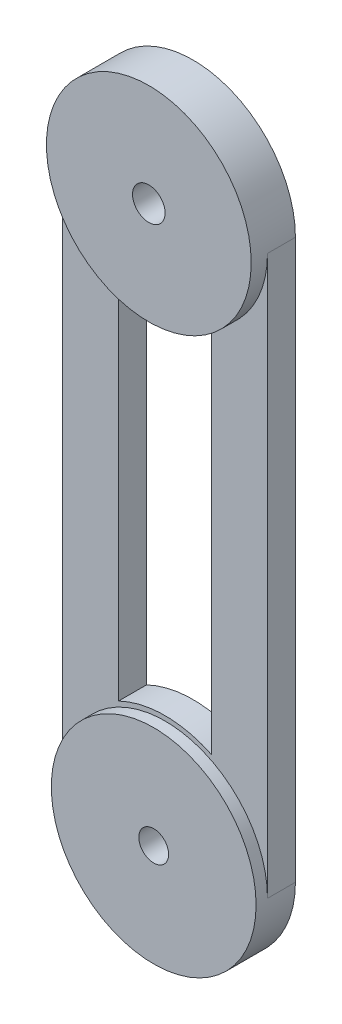
ISO-10303-21;
HEADER;
FILE_DESCRIPTION(('STEP AP214'),'2;1');
FILE_NAME('part.step','',(''),(''),'','','');
FILE_SCHEMA(('AUTOMOTIVE_DESIGN { 1 0 10303 214 1 1 1 1 }'));
ENDSEC;
DATA;
#1=APPLICATION_CONTEXT('core data for automotive mechanical design processes');
#2=APPLICATION_PROTOCOL_DEFINITION('international standard','automotive_design',2000,#1);
#3=PRODUCT_CONTEXT('',#1,'mechanical');
#4=PRODUCT('Part','Part','',(#3));
#5=PRODUCT_RELATED_PRODUCT_CATEGORY('part','',(#4));
#6=PRODUCT_DEFINITION_FORMATION('','',#4);
#7=PRODUCT_DEFINITION_CONTEXT('part definition',#1,'design');
#8=PRODUCT_DEFINITION('design','',#6,#7);
#9=PRODUCT_DEFINITION_SHAPE('','',#8);
#10=(LENGTH_UNIT() NAMED_UNIT(*) SI_UNIT(.MILLI.,.METRE.));
#11=(NAMED_UNIT(*) PLANE_ANGLE_UNIT() SI_UNIT($,.RADIAN.));
#12=(NAMED_UNIT(*) SI_UNIT($,.STERADIAN.) SOLID_ANGLE_UNIT());
#13=UNCERTAINTY_MEASURE_WITH_UNIT(LENGTH_MEASURE(1.E-05),#10,'distance_accuracy_value','');
#14=(GEOMETRIC_REPRESENTATION_CONTEXT(3) GLOBAL_UNCERTAINTY_ASSIGNED_CONTEXT((#13)) GLOBAL_UNIT_ASSIGNED_CONTEXT((#10,
#11,#12)) REPRESENTATION_CONTEXT('',''));
#15=CARTESIAN_POINT('',(0.,0.,0.));
#16=DIRECTION('',(0.,0.,1.));
#17=DIRECTION('',(1.,0.,0.));
#18=AXIS2_PLACEMENT_3D('',#15,#16,#17);
#19=CARTESIAN_POINT('',(0.,-30.,5.7504833995939));
#20=DIRECTION('',(0.,0.,-1.));
#21=DIRECTION('',(1.,0.,0.));
#22=AXIS2_PLACEMENT_3D('',#19,#20,#21);
#23=CYLINDRICAL_SURFACE('',#22,1.6);
#24=CARTESIAN_POINT('',(0.,-30.,1.225));
#25=DIRECTION('',(0.,0.,1.));
#26=DIRECTION('',(1.,0.,0.));
#27=AXIS2_PLACEMENT_3D('',#24,#25,#26);
#28=CIRCLE('',#27,1.6);
#29=CARTESIAN_POINT('',(1.59999999999999,-30.,1.225));
#30=VERTEX_POINT('',#29);
#31=EDGE_CURVE('E382',#30,#30,#28,.F.);
#32=ORIENTED_EDGE('',*,*,#31,.F.);
#33=EDGE_LOOP('',(#32));
#34=FACE_BOUND('',#33,.T.);
#35=CARTESIAN_POINT('',(0.,-30.,-1.775));
#36=DIRECTION('',(0.,0.,1.));
#37=DIRECTION('',(1.,0.,0.));
#38=AXIS2_PLACEMENT_3D('',#35,#36,#37);
#39=CIRCLE('',#38,1.6);
#40=CARTESIAN_POINT('',(1.59999999999999,-30.,-1.775));
#41=VERTEX_POINT('',#40);
#42=EDGE_CURVE('E381',#41,#41,#39,.F.);
#43=ORIENTED_EDGE('',*,*,#42,.T.);
#44=EDGE_LOOP('',(#43));
#45=FACE_BOUND('',#44,.T.);
#46=ADVANCED_FACE('F37',(#34,#45),#23,.F.);
#47=CARTESIAN_POINT('',(0.,30.,6.69974746830584));
#48=DIRECTION('',(0.,0.,-1.));
#49=DIRECTION('',(1.,0.,0.));
#50=AXIS2_PLACEMENT_3D('',#47,#48,#49);
#51=CYLINDRICAL_SURFACE('',#50,1.75);
#52=CARTESIAN_POINT('',(0.,30.,1.75));
#53=DIRECTION('',(0.,0.,1.));
#54=DIRECTION('',(1.,0.,0.));
#55=AXIS2_PLACEMENT_3D('',#52,#53,#54);
#56=CIRCLE('',#55,1.75);
#57=CARTESIAN_POINT('',(1.74999999999999,30.,1.75));
#58=VERTEX_POINT('',#57);
#59=EDGE_CURVE('E404',#58,#58,#56,.F.);
#60=ORIENTED_EDGE('',*,*,#59,.F.);
#61=EDGE_LOOP('',(#60));
#62=FACE_BOUND('',#61,.T.);
#63=CARTESIAN_POINT('',(0.,30.,-1.25));
#64=DIRECTION('',(0.,0.,1.));
#65=DIRECTION('',(1.,0.,0.));
#66=AXIS2_PLACEMENT_3D('',#63,#64,#65);
#67=CIRCLE('',#66,1.75);
#68=CARTESIAN_POINT('',(1.74999999999999,30.,-1.25));
#69=VERTEX_POINT('',#68);
#70=EDGE_CURVE('E394',#69,#69,#67,.F.);
#71=ORIENTED_EDGE('',*,*,#70,.T.);
#72=EDGE_LOOP('',(#71));
#73=FACE_BOUND('',#72,.T.);
#74=ADVANCED_FACE('F189',(#62,#73),#51,.F.);
#75=CARTESIAN_POINT('',(-11.,0.,-3.));
#76=DIRECTION('',(1.,0.,0.));
#77=DIRECTION('',(0.,0.,1.));
#78=AXIS2_PLACEMENT_3D('',#75,#76,#77);
#79=PLANE('',#78);
#80=DIRECTION('',(0.,-1.,0.));
#81=VECTOR('',#80,1.);
#82=CARTESIAN_POINT('',(-11.,0.,0.));
#83=LINE('',#82,#81);
#84=CARTESIAN_POINT('',(-11.,30.,0.));
#85=VERTEX_POINT('',#84);
#86=CARTESIAN_POINT('',(-11.,-30.,0.));
#87=VERTEX_POINT('',#86);
#88=EDGE_CURVE('E145',#85,#87,#83,.T.);
#89=ORIENTED_EDGE('',*,*,#88,.F.);
#90=DIRECTION('',(0.,0.,1.));
#91=VECTOR('',#90,1.);
#92=CARTESIAN_POINT('',(-11.,30.,-3.));
#93=LINE('',#92,#91);
#94=CARTESIAN_POINT('',(-11.,30.,-3.));
#95=VERTEX_POINT('',#94);
#96=EDGE_CURVE('E150',#95,#85,#93,.T.);
#97=ORIENTED_EDGE('',*,*,#96,.F.);
#98=DIRECTION('',(0.,-1.,0.));
#99=VECTOR('',#98,1.);
#100=CARTESIAN_POINT('',(-11.,0.,-3.));
#101=LINE('',#100,#99);
#102=CARTESIAN_POINT('',(-11.,-30.,-3.));
#103=VERTEX_POINT('',#102);
#104=EDGE_CURVE('E125',#95,#103,#101,.T.);
#105=ORIENTED_EDGE('',*,*,#104,.T.);
#106=DIRECTION('',(0.,0.,1.));
#107=VECTOR('',#106,1.);
#108=CARTESIAN_POINT('',(-11.,-30.,-3.));
#109=LINE('',#108,#107);
#110=EDGE_CURVE('E47',#103,#87,#109,.T.);
#111=ORIENTED_EDGE('',*,*,#110,.T.);
#112=EDGE_LOOP('',(#89,#97,#105,#111));
#113=FACE_BOUND('',#112,.T.);
#114=ADVANCED_FACE('F195',(#113),#79,.F.);
#115=CARTESIAN_POINT('',(0.,-30.,-3.));
#116=DIRECTION('',(0.,0.,1.));
#117=DIRECTION('',(-1.,0.,0.));
#118=AXIS2_PLACEMENT_3D('',#115,#116,#117);
#119=CYLINDRICAL_SURFACE('',#118,11.);
#120=ORIENTED_EDGE('',*,*,#110,.F.);
#121=CARTESIAN_POINT('',(0.,-30.,-3.));
#122=DIRECTION('',(0.,0.,1.));
#123=DIRECTION('',(1.,0.,0.));
#124=AXIS2_PLACEMENT_3D('',#121,#122,#123);
#125=CIRCLE('',#124,11.);
#126=CARTESIAN_POINT('',(11.,-30.,-3.));
#127=VERTEX_POINT('',#126);
#128=EDGE_CURVE('E111',#103,#127,#125,.T.);
#129=ORIENTED_EDGE('',*,*,#128,.T.);
#130=DIRECTION('',(0.,0.,1.));
#131=VECTOR('',#130,1.);
#132=CARTESIAN_POINT('',(11.,-30.,-3.));
#133=LINE('',#132,#131);
#134=CARTESIAN_POINT('',(11.,-30.,0.));
#135=VERTEX_POINT('',#134);
#136=EDGE_CURVE('E115',#127,#135,#133,.T.);
#137=ORIENTED_EDGE('',*,*,#136,.T.);
#138=CARTESIAN_POINT('',(0.,-30.,0.));
#139=DIRECTION('',(0.,0.,1.));
#140=DIRECTION('',(1.,0.,0.));
#141=AXIS2_PLACEMENT_3D('',#138,#139,#140);
#142=CIRCLE('',#141,11.);
#143=EDGE_CURVE('E385',#135,#87,#142,.T.);
#144=ORIENTED_EDGE('',*,*,#143,.T.);
#145=EDGE_LOOP('',(#120,#129,#137,#144));
#146=FACE_BOUND('',#145,.T.);
#147=CARTESIAN_POINT('',(0.,-30.,1.225));
#148=DIRECTION('',(0.,0.,1.));
#149=DIRECTION('',(1.,0.,0.));
#150=AXIS2_PLACEMENT_3D('',#147,#148,#149);
#151=CIRCLE('',#150,11.);
#152=CARTESIAN_POINT('',(11.,-30.,1.225));
#153=VERTEX_POINT('',#152);
#154=EDGE_CURVE('E391',#153,#153,#151,.T.);
#155=ORIENTED_EDGE('',*,*,#154,.F.);
#156=EDGE_LOOP('',(#155));
#157=FACE_BOUND('',#156,.T.);
#158=ADVANCED_FACE('F121',(#146,#157),#119,.T.);
#159=CARTESIAN_POINT('',(11.,0.,-3.));
#160=DIRECTION('',(1.,0.,0.));
#161=DIRECTION('',(0.,0.,1.));
#162=AXIS2_PLACEMENT_3D('',#159,#160,#161);
#163=PLANE('',#162);
#164=DIRECTION('',(0.,-1.,0.));
#165=VECTOR('',#164,1.);
#166=CARTESIAN_POINT('',(11.,0.,0.));
#167=LINE('',#166,#165);
#168=CARTESIAN_POINT('',(11.,30.,0.));
#169=VERTEX_POINT('',#168);
#170=EDGE_CURVE('E80',#169,#135,#167,.T.);
#171=ORIENTED_EDGE('',*,*,#170,.T.);
#172=ORIENTED_EDGE('',*,*,#136,.F.);
#173=DIRECTION('',(0.,-1.,0.));
#174=VECTOR('',#173,1.);
#175=CARTESIAN_POINT('',(11.,0.,-3.));
#176=LINE('',#175,#174);
#177=CARTESIAN_POINT('',(11.,30.,-3.));
#178=VERTEX_POINT('',#177);
#179=EDGE_CURVE('E108',#178,#127,#176,.T.);
#180=ORIENTED_EDGE('',*,*,#179,.F.);
#181=DIRECTION('',(0.,0.,1.));
#182=VECTOR('',#181,1.);
#183=CARTESIAN_POINT('',(11.,30.,-3.));
#184=LINE('',#183,#182);
#185=EDGE_CURVE('E119',#178,#169,#184,.T.);
#186=ORIENTED_EDGE('',*,*,#185,.T.);
#187=EDGE_LOOP('',(#171,#172,#180,#186));
#188=FACE_BOUND('',#187,.T.);
#189=ADVANCED_FACE('F116',(#188),#163,.T.);
#190=CARTESIAN_POINT('',(0.,30.,-3.));
#191=DIRECTION('',(0.,0.,1.));
#192=DIRECTION('',(-1.,0.,0.));
#193=AXIS2_PLACEMENT_3D('',#190,#191,#192);
#194=CYLINDRICAL_SURFACE('',#193,11.5);
#195=CARTESIAN_POINT('',(0.,30.,0.));
#196=DIRECTION('',(0.,0.,1.));
#197=DIRECTION('',(1.,0.,0.));
#198=AXIS2_PLACEMENT_3D('',#195,#196,#197);
#199=CIRCLE('',#198,11.5);
#200=CARTESIAN_POINT('',(-5.00000000000001,19.643842411396,0.));
#201=VERTEX_POINT('',#200);
#202=CARTESIAN_POINT('',(5.00000000000001,19.643842411396,0.));
#203=VERTEX_POINT('',#202);
#204=EDGE_CURVE('E133',#201,#203,#199,.T.);
#205=ORIENTED_EDGE('',*,*,#204,.F.);
#206=DIRECTION('',(0.,0.,1.));
#207=VECTOR('',#206,1.);
#208=CARTESIAN_POINT('',(-5.00000000000001,19.643842411396,-3.));
#209=LINE('',#208,#207);
#210=CARTESIAN_POINT('',(-5.00000000000001,19.643842411396,-3.));
#211=VERTEX_POINT('',#210);
#212=EDGE_CURVE('E132',#211,#201,#209,.T.);
#213=ORIENTED_EDGE('',*,*,#212,.F.);
#214=CARTESIAN_POINT('',(0.,30.,-3.));
#215=DIRECTION('',(0.,0.,1.));
#216=DIRECTION('',(1.,0.,0.));
#217=AXIS2_PLACEMENT_3D('',#214,#215,#216);
#218=CIRCLE('',#217,11.5);
#219=CARTESIAN_POINT('',(5.00000000000001,19.643842411396,-3.));
#220=VERTEX_POINT('',#219);
#221=EDGE_CURVE('E149',#211,#220,#218,.T.);
#222=ORIENTED_EDGE('',*,*,#221,.T.);
#223=DIRECTION('',(0.,0.,1.));
#224=VECTOR('',#223,1.);
#225=CARTESIAN_POINT('',(5.00000000000001,19.643842411396,-3.));
#226=LINE('',#225,#224);
#227=EDGE_CURVE('E41',#220,#203,#226,.T.);
#228=ORIENTED_EDGE('',*,*,#227,.T.);
#229=EDGE_LOOP('',(#205,#213,#222,#228));
#230=FACE_BOUND('',#229,.T.);
#231=ADVANCED_FACE('F39',(#230),#194,.T.);
#232=CARTESIAN_POINT('',(5.00000000000001,0.,-3.));
#233=DIRECTION('',(1.,0.,0.));
#234=DIRECTION('',(0.,0.,1.));
#235=AXIS2_PLACEMENT_3D('',#232,#233,#234);
#236=PLANE('',#235);
#237=DIRECTION('',(0.,-1.,0.));
#238=VECTOR('',#237,1.);
#239=CARTESIAN_POINT('',(5.00000000000001,0.,0.));
#240=LINE('',#239,#238);
#241=CARTESIAN_POINT('',(5.00000000000001,-19.643842411396,0.));
#242=VERTEX_POINT('',#241);
#243=EDGE_CURVE('E136',#203,#242,#240,.T.);
#244=ORIENTED_EDGE('',*,*,#243,.F.);
#245=ORIENTED_EDGE('',*,*,#227,.F.);
#246=DIRECTION('',(0.,-1.,0.));
#247=VECTOR('',#246,1.);
#248=CARTESIAN_POINT('',(5.00000000000001,0.,-3.));
#249=LINE('',#248,#247);
#250=CARTESIAN_POINT('',(5.00000000000001,-19.643842411396,-3.));
#251=VERTEX_POINT('',#250);
#252=EDGE_CURVE('E91',#220,#251,#249,.T.);
#253=ORIENTED_EDGE('',*,*,#252,.T.);
#254=DIRECTION('',(0.,0.,1.));
#255=VECTOR('',#254,1.);
#256=CARTESIAN_POINT('',(5.00000000000001,-19.643842411396,-3.));
#257=LINE('',#256,#255);
#258=EDGE_CURVE('E158',#251,#242,#257,.T.);
#259=ORIENTED_EDGE('',*,*,#258,.T.);
#260=EDGE_LOOP('',(#244,#245,#253,#259));
#261=FACE_BOUND('',#260,.T.);
#262=ADVANCED_FACE('F181',(#261),#236,.F.);
#263=CARTESIAN_POINT('',(0.,-30.,-3.));
#264=DIRECTION('',(0.,0.,1.));
#265=DIRECTION('',(-1.,0.,0.));
#266=AXIS2_PLACEMENT_3D('',#263,#264,#265);
#267=CYLINDRICAL_SURFACE('',#266,11.5);
#268=CARTESIAN_POINT('',(0.,-30.,0.));
#269=DIRECTION('',(0.,0.,1.));
#270=DIRECTION('',(1.,0.,0.));
#271=AXIS2_PLACEMENT_3D('',#268,#269,#270);
#272=CIRCLE('',#271,11.5);
#273=CARTESIAN_POINT('',(-5.,-19.643842411396,0.));
#274=VERTEX_POINT('',#273);
#275=EDGE_CURVE('E140',#242,#274,#272,.T.);
#276=ORIENTED_EDGE('',*,*,#275,.F.);
#277=ORIENTED_EDGE('',*,*,#258,.F.);
#278=CARTESIAN_POINT('',(0.,-30.,-3.));
#279=DIRECTION('',(0.,0.,1.));
#280=DIRECTION('',(1.,0.,0.));
#281=AXIS2_PLACEMENT_3D('',#278,#279,#280);
#282=CIRCLE('',#281,11.5);
#283=CARTESIAN_POINT('',(-5.,-19.643842411396,-3.));
#284=VERTEX_POINT('',#283);
#285=EDGE_CURVE('E174',#251,#284,#282,.T.);
#286=ORIENTED_EDGE('',*,*,#285,.T.);
#287=DIRECTION('',(0.,0.,1.));
#288=VECTOR('',#287,1.);
#289=CARTESIAN_POINT('',(-5.,-19.643842411396,-3.));
#290=LINE('',#289,#288);
#291=EDGE_CURVE('E156',#284,#274,#290,.T.);
#292=ORIENTED_EDGE('',*,*,#291,.T.);
#293=EDGE_LOOP('',(#276,#277,#286,#292));
#294=FACE_BOUND('',#293,.T.);
#295=ADVANCED_FACE('F180',(#294),#267,.T.);
#296=CARTESIAN_POINT('',(-5.00000000000001,0.,-3.));
#297=DIRECTION('',(1.,0.,0.));
#298=DIRECTION('',(0.,1.,0.));
#299=AXIS2_PLACEMENT_3D('',#296,#297,#298);
#300=PLANE('',#299);
#301=DIRECTION('',(0.,-1.,0.));
#302=VECTOR('',#301,1.);
#303=CARTESIAN_POINT('',(-5.00000000000001,0.,0.));
#304=LINE('',#303,#302);
#305=EDGE_CURVE('E143',#201,#274,#304,.T.);
#306=ORIENTED_EDGE('',*,*,#305,.T.);
#307=ORIENTED_EDGE('',*,*,#291,.F.);
#308=DIRECTION('',(0.,-1.,0.));
#309=VECTOR('',#308,1.);
#310=CARTESIAN_POINT('',(-5.00000000000001,0.,-3.));
#311=LINE('',#310,#309);
#312=EDGE_CURVE('E127',#211,#284,#311,.T.);
#313=ORIENTED_EDGE('',*,*,#312,.F.);
#314=ORIENTED_EDGE('',*,*,#212,.T.);
#315=EDGE_LOOP('',(#306,#307,#313,#314));
#316=FACE_BOUND('',#315,.T.);
#317=ADVANCED_FACE('F172',(#316),#300,.T.);
#318=CARTESIAN_POINT('',(0.,30.,-3.));
#319=DIRECTION('',(0.,0.,1.));
#320=DIRECTION('',(-1.,0.,0.));
#321=AXIS2_PLACEMENT_3D('',#318,#319,#320);
#322=CYLINDRICAL_SURFACE('',#321,11.);
#323=ORIENTED_EDGE('',*,*,#185,.F.);
#324=CARTESIAN_POINT('',(0.,30.,-3.));
#325=DIRECTION('',(0.,0.,1.));
#326=DIRECTION('',(1.,0.,0.));
#327=AXIS2_PLACEMENT_3D('',#324,#325,#326);
#328=CIRCLE('',#327,11.);
#329=EDGE_CURVE('E56',#178,#95,#328,.T.);
#330=ORIENTED_EDGE('',*,*,#329,.T.);
#331=ORIENTED_EDGE('',*,*,#96,.T.);
#332=CARTESIAN_POINT('',(0.,30.,0.));
#333=DIRECTION('',(0.,0.,1.));
#334=DIRECTION('',(1.,0.,0.));
#335=AXIS2_PLACEMENT_3D('',#332,#333,#334);
#336=CIRCLE('',#335,11.);
#337=EDGE_CURVE('E12',#85,#169,#336,.T.);
#338=ORIENTED_EDGE('',*,*,#337,.T.);
#339=EDGE_LOOP('',(#323,#330,#331,#338));
#340=FACE_BOUND('',#339,.T.);
#341=CARTESIAN_POINT('',(0.,30.,1.75));
#342=DIRECTION('',(0.,0.,1.));
#343=DIRECTION('',(1.,0.,0.));
#344=AXIS2_PLACEMENT_3D('',#341,#342,#343);
#345=CIRCLE('',#344,11.);
#346=CARTESIAN_POINT('',(11.,30.,1.75));
#347=VERTEX_POINT('',#346);
#348=EDGE_CURVE('E137',#347,#347,#345,.T.);
#349=ORIENTED_EDGE('',*,*,#348,.F.);
#350=EDGE_LOOP('',(#349));
#351=FACE_BOUND('',#350,.T.);
#352=ADVANCED_FACE('F222',(#340,#351),#322,.T.);
#353=CARTESIAN_POINT('',(0.,0.,-3.));
#354=DIRECTION('',(0.,0.,-1.));
#355=DIRECTION('',(1.,0.,0.));
#356=AXIS2_PLACEMENT_3D('',#353,#354,#355);
#357=PLANE('',#356);
#358=CARTESIAN_POINT('',(0.,-30.,-3.));
#359=DIRECTION('',(0.,0.,1.));
#360=DIRECTION('',(1.,0.,0.));
#361=AXIS2_PLACEMENT_3D('',#358,#359,#360);
#362=CIRCLE('',#361,3.);
#363=CARTESIAN_POINT('',(2.99999999999999,-30.,-3.));
#364=VERTEX_POINT('',#363);
#365=EDGE_CURVE('E387',#364,#364,#362,.T.);
#366=ORIENTED_EDGE('',*,*,#365,.T.);
#367=EDGE_LOOP('',(#366));
#368=FACE_BOUND('',#367,.T.);
#369=CARTESIAN_POINT('',(0.,30.,-3.));
#370=DIRECTION('',(0.,0.,1.));
#371=DIRECTION('',(1.,0.,0.));
#372=AXIS2_PLACEMENT_3D('',#369,#370,#371);
#373=CIRCLE('',#372,3.);
#374=CARTESIAN_POINT('',(2.99999999999999,30.,-3.));
#375=VERTEX_POINT('',#374);
#376=EDGE_CURVE('E396',#375,#375,#373,.T.);
#377=ORIENTED_EDGE('',*,*,#376,.T.);
#378=EDGE_LOOP('',(#377));
#379=FACE_BOUND('',#378,.T.);
#380=ORIENTED_EDGE('',*,*,#221,.F.);
#381=ORIENTED_EDGE('',*,*,#312,.T.);
#382=ORIENTED_EDGE('',*,*,#285,.F.);
#383=ORIENTED_EDGE('',*,*,#252,.F.);
#384=EDGE_LOOP('',(#380,#381,#382,#383));
#385=FACE_BOUND('',#384,.T.);
#386=ORIENTED_EDGE('',*,*,#104,.F.);
#387=ORIENTED_EDGE('',*,*,#329,.F.);
#388=ORIENTED_EDGE('',*,*,#179,.T.);
#389=ORIENTED_EDGE('',*,*,#128,.F.);
#390=EDGE_LOOP('',(#386,#387,#388,#389));
#391=FACE_BOUND('',#390,.T.);
#392=ADVANCED_FACE('F109',(#368,#379,#385,#391),#357,.T.);
#393=CARTESIAN_POINT('',(0.,0.,0.));
#394=DIRECTION('',(0.,0.,-1.));
#395=DIRECTION('',(1.,0.,0.));
#396=AXIS2_PLACEMENT_3D('',#393,#394,#395);
#397=PLANE('',#396);
#398=ORIENTED_EDGE('',*,*,#204,.T.);
#399=ORIENTED_EDGE('',*,*,#243,.T.);
#400=ORIENTED_EDGE('',*,*,#275,.T.);
#401=ORIENTED_EDGE('',*,*,#305,.F.);
#402=EDGE_LOOP('',(#398,#399,#400,#401));
#403=FACE_BOUND('',#402,.T.);
#404=ORIENTED_EDGE('',*,*,#170,.F.);
#405=ORIENTED_EDGE('',*,*,#337,.F.);
#406=ORIENTED_EDGE('',*,*,#88,.T.);
#407=ORIENTED_EDGE('',*,*,#143,.F.);
#408=EDGE_LOOP('',(#404,#405,#406,#407));
#409=FACE_BOUND('',#408,.T.);
#410=ADVANCED_FACE('F168',(#403,#409),#397,.F.);
#411=CARTESIAN_POINT('',(0.,0.,1.75));
#412=DIRECTION('',(0.,0.,-1.));
#413=DIRECTION('',(1.,0.,0.));
#414=AXIS2_PLACEMENT_3D('',#411,#412,#413);
#415=PLANE('',#414);
#416=ORIENTED_EDGE('',*,*,#59,.T.);
#417=EDGE_LOOP('',(#416));
#418=FACE_BOUND('',#417,.T.);
#419=ORIENTED_EDGE('',*,*,#348,.T.);
#420=EDGE_LOOP('',(#419));
#421=FACE_BOUND('',#420,.T.);
#422=ADVANCED_FACE('F212',(#418,#421),#415,.F.);
#423=CARTESIAN_POINT('',(0.,30.,10.2352813742386));
#424=DIRECTION('',(0.,0.,-1.));
#425=DIRECTION('',(1.,0.,0.));
#426=AXIS2_PLACEMENT_3D('',#423,#424,#425);
#427=CYLINDRICAL_SURFACE('',#426,3.);
#428=CARTESIAN_POINT('',(0.,30.,-1.25));
#429=DIRECTION('',(0.,0.,1.));
#430=DIRECTION('',(1.,0.,0.));
#431=AXIS2_PLACEMENT_3D('',#428,#429,#430);
#432=CIRCLE('',#431,3.);
#433=CARTESIAN_POINT('',(2.99999999999999,30.,-1.25));
#434=VERTEX_POINT('',#433);
#435=EDGE_CURVE('E399',#434,#434,#432,.F.);
#436=ORIENTED_EDGE('',*,*,#435,.F.);
#437=EDGE_LOOP('',(#436));
#438=FACE_BOUND('',#437,.T.);
#439=ORIENTED_EDGE('',*,*,#376,.F.);
#440=EDGE_LOOP('',(#439));
#441=FACE_BOUND('',#440,.T.);
#442=ADVANCED_FACE('F209',(#438,#441),#427,.F.);
#443=CARTESIAN_POINT('',(0.,0.,-1.25));
#444=DIRECTION('',(0.,0.,-1.));
#445=DIRECTION('',(1.,0.,0.));
#446=AXIS2_PLACEMENT_3D('',#443,#444,#445);
#447=PLANE('',#446);
#448=ORIENTED_EDGE('',*,*,#435,.T.);
#449=EDGE_LOOP('',(#448));
#450=FACE_BOUND('',#449,.T.);
#451=ORIENTED_EDGE('',*,*,#70,.F.);
#452=EDGE_LOOP('',(#451));
#453=FACE_BOUND('',#452,.T.);
#454=ADVANCED_FACE('F207',(#450,#453),#447,.T.);
#455=CARTESIAN_POINT('',(0.,0.,1.225));
#456=DIRECTION('',(0.,0.,-1.));
#457=DIRECTION('',(1.,0.,0.));
#458=AXIS2_PLACEMENT_3D('',#455,#456,#457);
#459=PLANE('',#458);
#460=ORIENTED_EDGE('',*,*,#31,.T.);
#461=EDGE_LOOP('',(#460));
#462=FACE_BOUND('',#461,.T.);
#463=ORIENTED_EDGE('',*,*,#154,.T.);
#464=EDGE_LOOP('',(#463));
#465=FACE_BOUND('',#464,.T.);
#466=ADVANCED_FACE('F204',(#462,#465),#459,.F.);
#467=CARTESIAN_POINT('',(0.,-30.,9.71028137423857));
#468=DIRECTION('',(0.,0.,-1.));
#469=DIRECTION('',(1.,0.,0.));
#470=AXIS2_PLACEMENT_3D('',#467,#468,#469);
#471=CYLINDRICAL_SURFACE('',#470,3.);
#472=CARTESIAN_POINT('',(0.,-30.,-1.775));
#473=DIRECTION('',(0.,0.,1.));
#474=DIRECTION('',(1.,0.,0.));
#475=AXIS2_PLACEMENT_3D('',#472,#473,#474);
#476=CIRCLE('',#475,3.);
#477=CARTESIAN_POINT('',(2.99999999999999,-30.,-1.775));
#478=VERTEX_POINT('',#477);
#479=EDGE_CURVE('E378',#478,#478,#476,.F.);
#480=ORIENTED_EDGE('',*,*,#479,.F.);
#481=EDGE_LOOP('',(#480));
#482=FACE_BOUND('',#481,.T.);
#483=ORIENTED_EDGE('',*,*,#365,.F.);
#484=EDGE_LOOP('',(#483));
#485=FACE_BOUND('',#484,.T.);
#486=ADVANCED_FACE('F202',(#482,#485),#471,.F.);
#487=CARTESIAN_POINT('',(0.,0.,-1.775));
#488=DIRECTION('',(0.,0.,-1.));
#489=DIRECTION('',(1.,0.,0.));
#490=AXIS2_PLACEMENT_3D('',#487,#488,#489);
#491=PLANE('',#490);
#492=ORIENTED_EDGE('',*,*,#479,.T.);
#493=EDGE_LOOP('',(#492));
#494=FACE_BOUND('',#493,.T.);
#495=ORIENTED_EDGE('',*,*,#42,.F.);
#496=EDGE_LOOP('',(#495));
#497=FACE_BOUND('',#496,.T.);
#498=ADVANCED_FACE('F274',(#494,#497),#491,.T.);
#499=CLOSED_SHELL('',(#46,#74,#114,#158,#189,#231,#262,#295,#317,#352,#392,#410,#422,#442,#454,
#466,#486,#498));
#500=MANIFOLD_SOLID_BREP('B2',#499);
#501=ADVANCED_BREP_SHAPE_REPRESENTATION('',(#18,#500),#14);
#502=SHAPE_DEFINITION_REPRESENTATION(#9,#501);
ENDSEC;
END-ISO-10303-21;
